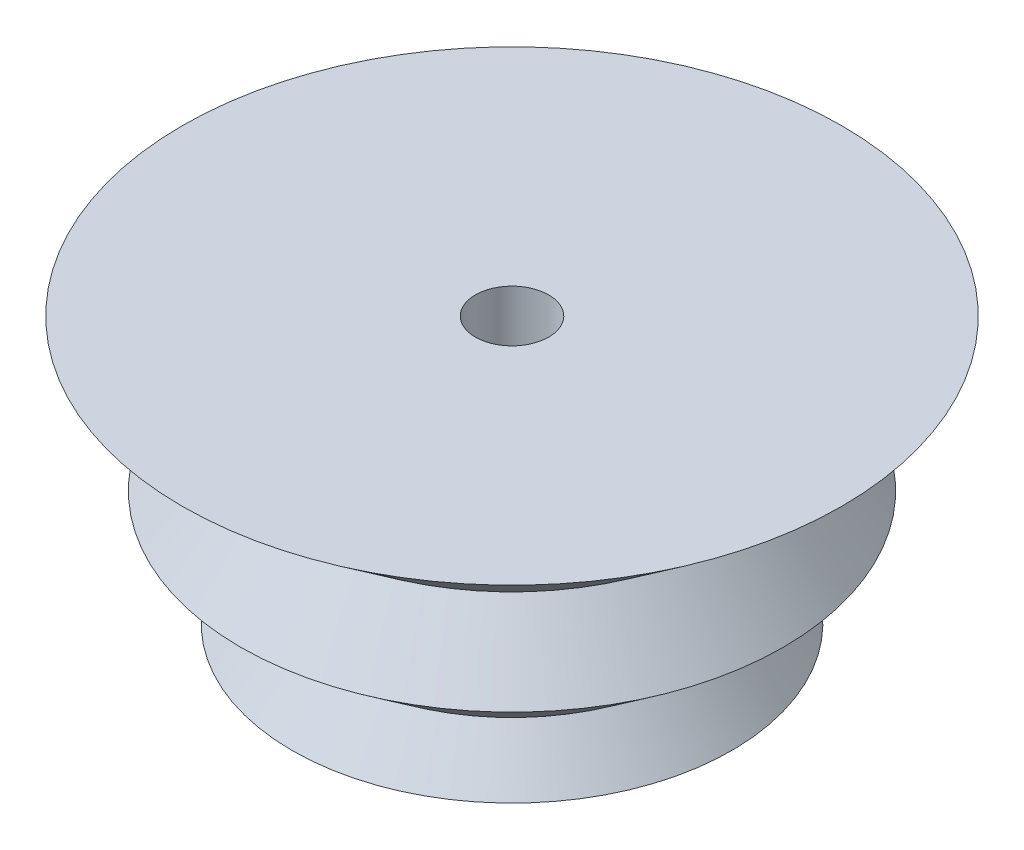
ISO-10303-21;
HEADER;
FILE_DESCRIPTION(('STEP AP214'),'2;1');
FILE_NAME('part.step','',(''),(''),'','','');
FILE_SCHEMA(('AUTOMOTIVE_DESIGN { 1 0 10303 214 1 1 1 1 }'));
ENDSEC;
DATA;
#1=APPLICATION_CONTEXT('core data for automotive mechanical design processes');
#2=APPLICATION_PROTOCOL_DEFINITION('international standard','automotive_design',2000,#1);
#3=PRODUCT_CONTEXT('',#1,'mechanical');
#4=PRODUCT('Part','Part','',(#3));
#5=PRODUCT_RELATED_PRODUCT_CATEGORY('part','',(#4));
#6=PRODUCT_DEFINITION_FORMATION('','',#4);
#7=PRODUCT_DEFINITION_CONTEXT('part definition',#1,'design');
#8=PRODUCT_DEFINITION('design','',#6,#7);
#9=PRODUCT_DEFINITION_SHAPE('','',#8);
#10=(LENGTH_UNIT() NAMED_UNIT(*) SI_UNIT(.MILLI.,.METRE.));
#11=(NAMED_UNIT(*) PLANE_ANGLE_UNIT() SI_UNIT($,.RADIAN.));
#12=(NAMED_UNIT(*) SI_UNIT($,.STERADIAN.) SOLID_ANGLE_UNIT());
#13=UNCERTAINTY_MEASURE_WITH_UNIT(LENGTH_MEASURE(1.E-05),#10,'distance_accuracy_value','');
#14=(GEOMETRIC_REPRESENTATION_CONTEXT(3) GLOBAL_UNCERTAINTY_ASSIGNED_CONTEXT((#13)) GLOBAL_UNIT_ASSIGNED_CONTEXT((#10,
#11,#12)) REPRESENTATION_CONTEXT('',''));
#15=CARTESIAN_POINT('',(0.,0.,0.));
#16=DIRECTION('',(0.,0.,1.));
#17=DIRECTION('',(1.,0.,0.));
#18=AXIS2_PLACEMENT_3D('',#15,#16,#17);
#19=CARTESIAN_POINT('',(0.,0.,0.));
#20=DIRECTION('',(0.,1.,0.));
#21=DIRECTION('',(0.,0.,1.));
#22=AXIS2_PLACEMENT_3D('',#19,#20,#21);
#23=PLANE('',#22);
#24=CARTESIAN_POINT('',(0.,0.,0.));
#25=DIRECTION('',(0.,1.,0.));
#26=DIRECTION('',(0.,0.,1.));
#27=AXIS2_PLACEMENT_3D('',#24,#25,#26);
#28=CIRCLE('',#27,0.5);
#29=CARTESIAN_POINT('',(0.,0.,0.5));
#30=VERTEX_POINT('',#29);
#31=EDGE_CURVE('E53',#30,#30,#28,.T.);
#32=ORIENTED_EDGE('',*,*,#31,.T.);
#33=EDGE_LOOP('',(#32));
#34=FACE_BOUND('',#33,.T.);
#35=CARTESIAN_POINT('',(0.,0.,0.));
#36=DIRECTION('',(0.,1.,0.));
#37=DIRECTION('',(0.,0.,1.));
#38=AXIS2_PLACEMENT_3D('',#35,#36,#37);
#39=CIRCLE('',#38,3.);
#40=CARTESIAN_POINT('',(0.,0.,3.));
#41=VERTEX_POINT('',#40);
#42=EDGE_CURVE('E10',#41,#41,#39,.T.);
#43=ORIENTED_EDGE('',*,*,#42,.F.);
#44=EDGE_LOOP('',(#43));
#45=FACE_BOUND('',#44,.T.);
#46=ADVANCED_FACE('F31',(#34,#45),#23,.F.);
#47=CARTESIAN_POINT('',(0.,0.,0.));
#48=DIRECTION('',(0.,-1.,0.));
#49=DIRECTION('',(0.,0.,-1.));
#50=AXIS2_PLACEMENT_3D('',#47,#48,#49);
#51=CONICAL_SURFACE('',#50,3.,0.650129824075622);
#52=CARTESIAN_POINT('',(0.,0.657540642419459,0.));
#53=DIRECTION('',(0.,1.,0.));
#54=DIRECTION('',(0.,0.,1.));
#55=AXIS2_PLACEMENT_3D('',#52,#53,#54);
#56=CIRCLE('',#55,2.5);
#57=CARTESIAN_POINT('',(0.,0.657540642419459,2.5));
#58=VERTEX_POINT('',#57);
#59=EDGE_CURVE('E37',#58,#58,#56,.T.);
#60=ORIENTED_EDGE('',*,*,#59,.F.);
#61=EDGE_LOOP('',(#60));
#62=FACE_BOUND('',#61,.T.);
#63=ORIENTED_EDGE('',*,*,#42,.T.);
#64=EDGE_LOOP('',(#63));
#65=FACE_BOUND('',#64,.T.);
#66=ADVANCED_FACE('F88',(#62,#65),#51,.T.);
#67=CARTESIAN_POINT('',(0.,0.657540642419459,0.));
#68=DIRECTION('',(0.,1.,0.));
#69=DIRECTION('',(0.,0.,1.));
#70=AXIS2_PLACEMENT_3D('',#67,#68,#69);
#71=CONICAL_SURFACE('',#70,2.5,0.920666502719274);
#72=CARTESIAN_POINT('',(0.,1.5720234416211,0.));
#73=DIRECTION('',(0.,1.,0.));
#74=DIRECTION('',(0.,0.,1.));
#75=AXIS2_PLACEMENT_3D('',#72,#73,#74);
#76=CIRCLE('',#75,3.70261921453718);
#77=CARTESIAN_POINT('',(0.,1.5720234416211,3.70261921453718));
#78=VERTEX_POINT('',#77);
#79=EDGE_CURVE('E41',#78,#78,#76,.T.);
#80=ORIENTED_EDGE('',*,*,#79,.F.);
#81=EDGE_LOOP('',(#80));
#82=FACE_BOUND('',#81,.T.);
#83=ORIENTED_EDGE('',*,*,#59,.T.);
#84=EDGE_LOOP('',(#83));
#85=FACE_BOUND('',#84,.T.);
#86=ADVANCED_FACE('F83',(#82,#85),#71,.T.);
#87=CARTESIAN_POINT('',(0.,1.5720234416211,0.));
#88=DIRECTION('',(0.,-1.,0.));
#89=DIRECTION('',(0.,0.,-1.));
#90=AXIS2_PLACEMENT_3D('',#87,#88,#89);
#91=CONICAL_SURFACE('',#90,3.70261921453718,0.650129824075623);
#92=CARTESIAN_POINT('',(0.,2.49602482102716,0.));
#93=DIRECTION('',(0.,1.,0.));
#94=DIRECTION('',(0.,0.,1.));
#95=AXIS2_PLACEMENT_3D('',#92,#93,#94);
#96=CIRCLE('',#95,3.);
#97=CARTESIAN_POINT('',(0.,2.49602482102716,3.));
#98=VERTEX_POINT('',#97);
#99=EDGE_CURVE('E45',#98,#98,#96,.T.);
#100=ORIENTED_EDGE('',*,*,#99,.F.);
#101=EDGE_LOOP('',(#100));
#102=FACE_BOUND('',#101,.T.);
#103=ORIENTED_EDGE('',*,*,#79,.T.);
#104=EDGE_LOOP('',(#103));
#105=FACE_BOUND('',#104,.T.);
#106=ADVANCED_FACE('F77',(#102,#105),#91,.T.);
#107=CARTESIAN_POINT('',(0.,2.49602482102716,0.));
#108=DIRECTION('',(0.,1.,0.));
#109=DIRECTION('',(0.,0.,1.));
#110=AXIS2_PLACEMENT_3D('',#107,#108,#109);
#111=CONICAL_SURFACE('',#110,3.,0.920666502719274);
#112=CARTESIAN_POINT('',(0.,3.63663872626096,0.));
#113=DIRECTION('',(0.,1.,0.));
#114=DIRECTION('',(0.,0.,1.));
#115=AXIS2_PLACEMENT_3D('',#112,#113,#114);
#116=CIRCLE('',#115,4.5);
#117=CARTESIAN_POINT('',(0.,3.63663872626096,4.5));
#118=VERTEX_POINT('',#117);
#119=EDGE_CURVE('E50',#118,#118,#116,.T.);
#120=ORIENTED_EDGE('',*,*,#119,.F.);
#121=EDGE_LOOP('',(#120));
#122=FACE_BOUND('',#121,.T.);
#123=ORIENTED_EDGE('',*,*,#99,.T.);
#124=EDGE_LOOP('',(#123));
#125=FACE_BOUND('',#124,.T.);
#126=ADVANCED_FACE('F71',(#122,#125),#111,.T.);
#127=CARTESIAN_POINT('',(4.5,3.63663872626096,0.));
#128=DIRECTION('',(0.,-1.,0.));
#129=DIRECTION('',(0.,0.,-1.));
#130=AXIS2_PLACEMENT_3D('',#127,#128,#129);
#131=PLANE('',#130);
#132=CARTESIAN_POINT('',(0.,3.63663872626096,0.));
#133=DIRECTION('',(0.,1.,0.));
#134=DIRECTION('',(0.,0.,1.));
#135=AXIS2_PLACEMENT_3D('',#132,#133,#134);
#136=CIRCLE('',#135,0.5);
#137=CARTESIAN_POINT('',(0.,3.63663872626096,0.5));
#138=VERTEX_POINT('',#137);
#139=EDGE_CURVE('E54',#138,#138,#136,.T.);
#140=ORIENTED_EDGE('',*,*,#139,.F.);
#141=EDGE_LOOP('',(#140));
#142=FACE_BOUND('',#141,.T.);
#143=ORIENTED_EDGE('',*,*,#119,.T.);
#144=EDGE_LOOP('',(#143));
#145=FACE_BOUND('',#144,.T.);
#146=ADVANCED_FACE('F65',(#142,#145),#131,.F.);
#147=CARTESIAN_POINT('',(0.,0.,0.));
#148=DIRECTION('',(0.,1.,0.));
#149=DIRECTION('',(0.,0.,1.));
#150=AXIS2_PLACEMENT_3D('',#147,#148,#149);
#151=CYLINDRICAL_SURFACE('',#150,0.5);
#152=ORIENTED_EDGE('',*,*,#31,.F.);
#153=EDGE_LOOP('',(#152));
#154=FACE_BOUND('',#153,.T.);
#155=ORIENTED_EDGE('',*,*,#139,.T.);
#156=EDGE_LOOP('',(#155));
#157=FACE_BOUND('',#156,.T.);
#158=ADVANCED_FACE('F62',(#154,#157),#151,.F.);
#159=CLOSED_SHELL('',(#46,#66,#86,#106,#126,#146,#158));
#160=MANIFOLD_SOLID_BREP('B2',#159);
#161=ADVANCED_BREP_SHAPE_REPRESENTATION('',(#18,#160),#14);
#162=SHAPE_DEFINITION_REPRESENTATION(#9,#161);
ENDSEC;
END-ISO-10303-21;
